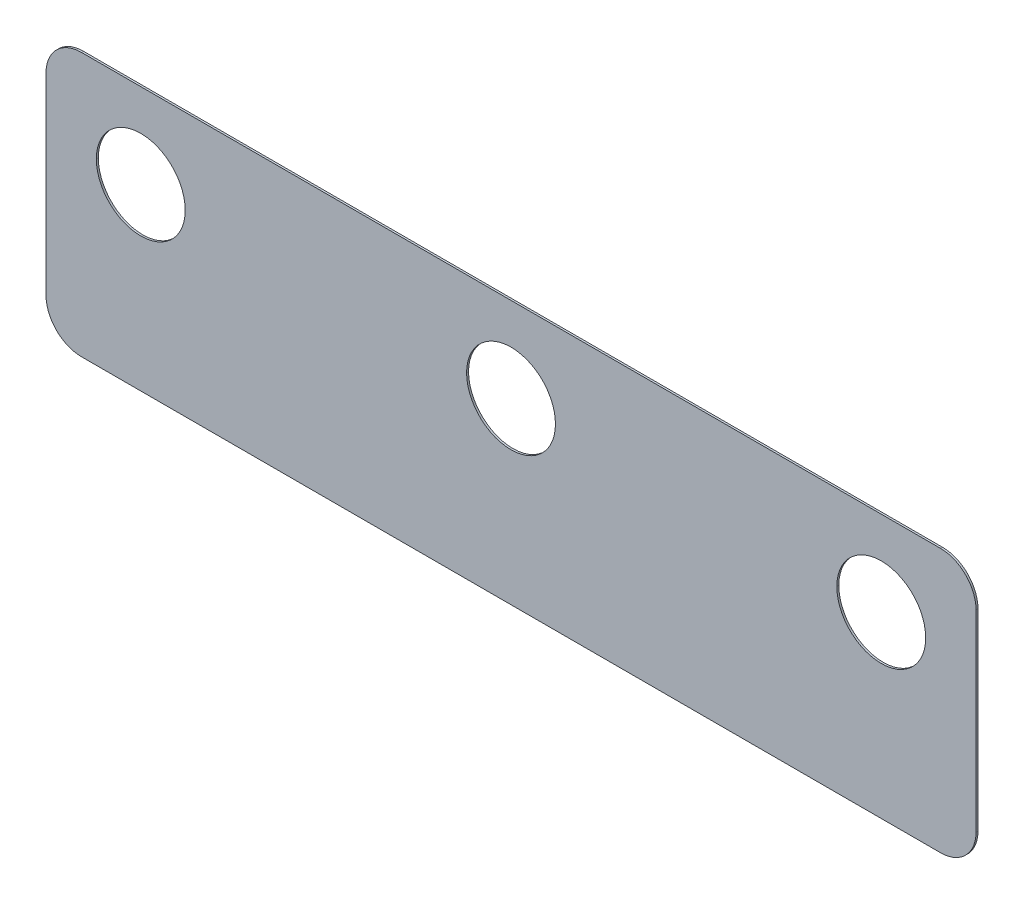
ISO-10303-21;
HEADER;
FILE_DESCRIPTION(('STEP AP214'),'2;1');
FILE_NAME('part.step','',(''),(''),'','','');
FILE_SCHEMA(('AUTOMOTIVE_DESIGN { 1 0 10303 214 1 1 1 1 }'));
ENDSEC;
DATA;
#1=APPLICATION_CONTEXT('core data for automotive mechanical design processes');
#2=APPLICATION_PROTOCOL_DEFINITION('international standard','automotive_design',2000,#1);
#3=PRODUCT_CONTEXT('',#1,'mechanical');
#4=PRODUCT('Part','Part','',(#3));
#5=PRODUCT_RELATED_PRODUCT_CATEGORY('part','',(#4));
#6=PRODUCT_DEFINITION_FORMATION('','',#4);
#7=PRODUCT_DEFINITION_CONTEXT('part definition',#1,'design');
#8=PRODUCT_DEFINITION('design','',#6,#7);
#9=PRODUCT_DEFINITION_SHAPE('','',#8);
#10=(LENGTH_UNIT() NAMED_UNIT(*) SI_UNIT(.MILLI.,.METRE.));
#11=(NAMED_UNIT(*) PLANE_ANGLE_UNIT() SI_UNIT($,.RADIAN.));
#12=(NAMED_UNIT(*) SI_UNIT($,.STERADIAN.) SOLID_ANGLE_UNIT());
#13=UNCERTAINTY_MEASURE_WITH_UNIT(LENGTH_MEASURE(1.E-05),#10,'distance_accuracy_value','');
#14=(GEOMETRIC_REPRESENTATION_CONTEXT(3) GLOBAL_UNCERTAINTY_ASSIGNED_CONTEXT((#13)) GLOBAL_UNIT_ASSIGNED_CONTEXT((#10,
#11,#12)) REPRESENTATION_CONTEXT('',''));
#15=CARTESIAN_POINT('',(0.,0.,0.));
#16=DIRECTION('',(0.,0.,1.));
#17=DIRECTION('',(1.,0.,0.));
#18=AXIS2_PLACEMENT_3D('',#15,#16,#17);
#19=CARTESIAN_POINT('',(47.1,8.6,0.));
#20=DIRECTION('',(0.,1.,0.));
#21=DIRECTION('',(1.,0.,0.));
#22=AXIS2_PLACEMENT_3D('',#19,#20,#21);
#23=PLANE('',#22);
#24=DIRECTION('',(-1.,0.,0.));
#25=VECTOR('',#24,1.);
#26=CARTESIAN_POINT('',(43.5,8.6,0.));
#27=LINE('',#26,#25);
#28=CARTESIAN_POINT('',(43.5,8.6,0.));
#29=VERTEX_POINT('',#28);
#30=CARTESIAN_POINT('',(-43.5,8.6,0.));
#31=VERTEX_POINT('',#30);
#32=EDGE_CURVE('E233',#29,#31,#27,.T.);
#33=ORIENTED_EDGE('',*,*,#32,.T.);
#34=DIRECTION('',(0.,0.,-1.));
#35=VECTOR('',#34,1.);
#36=CARTESIAN_POINT('',(-43.5,8.6,0.2));
#37=LINE('',#36,#35);
#38=CARTESIAN_POINT('',(-43.5,8.6,0.2));
#39=VERTEX_POINT('',#38);
#40=EDGE_CURVE('E11',#39,#31,#37,.T.);
#41=ORIENTED_EDGE('',*,*,#40,.F.);
#42=DIRECTION('',(-1.,0.,0.));
#43=VECTOR('',#42,1.);
#44=CARTESIAN_POINT('',(43.5,8.6,0.2));
#45=LINE('',#44,#43);
#46=CARTESIAN_POINT('',(43.5,8.6,0.2));
#47=VERTEX_POINT('',#46);
#48=EDGE_CURVE('E204',#47,#39,#45,.T.);
#49=ORIENTED_EDGE('',*,*,#48,.F.);
#50=DIRECTION('',(0.,0.,-1.));
#51=VECTOR('',#50,1.);
#52=CARTESIAN_POINT('',(43.5,8.6,0.2));
#53=LINE('',#52,#51);
#54=EDGE_CURVE('E228',#47,#29,#53,.T.);
#55=ORIENTED_EDGE('',*,*,#54,.T.);
#56=EDGE_LOOP('',(#33,#41,#49,#55));
#57=FACE_BOUND('',#56,.T.);
#58=ADVANCED_FACE('F17',(#57),#23,.T.);
#59=CARTESIAN_POINT('',(-43.5,5.,4.54888));
#60=DIRECTION('',(0.,0.,-1.));
#61=DIRECTION('',(-1.,0.,0.));
#62=AXIS2_PLACEMENT_3D('',#59,#60,#61);
#63=CYLINDRICAL_SURFACE('',#62,3.6);
#64=DIRECTION('',(0.,0.,-1.));
#65=VECTOR('',#64,1.);
#66=CARTESIAN_POINT('',(-47.1,5.,0.2));
#67=LINE('',#66,#65);
#68=CARTESIAN_POINT('',(-47.1,5.,0.2));
#69=VERTEX_POINT('',#68);
#70=CARTESIAN_POINT('',(-47.1,5.,0.));
#71=VERTEX_POINT('',#70);
#72=EDGE_CURVE('E27',#69,#71,#67,.T.);
#73=ORIENTED_EDGE('',*,*,#72,.F.);
#74=CARTESIAN_POINT('',(-43.5,5.,0.2));
#75=DIRECTION('',(0.,0.,1.));
#76=DIRECTION('',(0.,1.,0.));
#77=AXIS2_PLACEMENT_3D('',#74,#75,#76);
#78=CIRCLE('',#77,3.6);
#79=EDGE_CURVE('E214',#39,#69,#78,.T.);
#80=ORIENTED_EDGE('',*,*,#79,.F.);
#81=ORIENTED_EDGE('',*,*,#40,.T.);
#82=CARTESIAN_POINT('',(-43.5,5.,0.));
#83=DIRECTION('',(0.,0.,-1.));
#84=DIRECTION('',(-1.,0.,0.));
#85=AXIS2_PLACEMENT_3D('',#82,#83,#84);
#86=CIRCLE('',#85,3.6);
#87=EDGE_CURVE('E229',#71,#31,#86,.T.);
#88=ORIENTED_EDGE('',*,*,#87,.F.);
#89=EDGE_LOOP('',(#73,#80,#81,#88));
#90=FACE_BOUND('',#89,.T.);
#91=ADVANCED_FACE('F343',(#90),#63,.T.);
#92=CARTESIAN_POINT('',(-47.1,8.6,0.));
#93=DIRECTION('',(-1.,0.,0.));
#94=DIRECTION('',(0.,0.,1.));
#95=AXIS2_PLACEMENT_3D('',#92,#93,#94);
#96=PLANE('',#95);
#97=DIRECTION('',(0.,-1.,0.));
#98=VECTOR('',#97,1.);
#99=CARTESIAN_POINT('',(-47.1,5.,0.));
#100=LINE('',#99,#98);
#101=CARTESIAN_POINT('',(-47.1,-14.5,0.));
#102=VERTEX_POINT('',#101);
#103=EDGE_CURVE('E234',#71,#102,#100,.T.);
#104=ORIENTED_EDGE('',*,*,#103,.T.);
#105=DIRECTION('',(0.,0.,-1.));
#106=VECTOR('',#105,1.);
#107=CARTESIAN_POINT('',(-47.1,-14.5,0.2));
#108=LINE('',#107,#106);
#109=CARTESIAN_POINT('',(-47.1,-14.5,0.2));
#110=VERTEX_POINT('',#109);
#111=EDGE_CURVE('E248',#110,#102,#108,.T.);
#112=ORIENTED_EDGE('',*,*,#111,.F.);
#113=DIRECTION('',(0.,-1.,0.));
#114=VECTOR('',#113,1.);
#115=CARTESIAN_POINT('',(-47.1,5.,0.2));
#116=LINE('',#115,#114);
#117=EDGE_CURVE('E242',#69,#110,#116,.T.);
#118=ORIENTED_EDGE('',*,*,#117,.F.);
#119=ORIENTED_EDGE('',*,*,#72,.T.);
#120=EDGE_LOOP('',(#104,#112,#118,#119));
#121=FACE_BOUND('',#120,.T.);
#122=ADVANCED_FACE('F339',(#121),#96,.T.);
#123=CARTESIAN_POINT('',(-43.5,-14.5,4.54888));
#124=DIRECTION('',(0.,0.,-1.));
#125=DIRECTION('',(0.,-1.,0.));
#126=AXIS2_PLACEMENT_3D('',#123,#124,#125);
#127=CYLINDRICAL_SURFACE('',#126,3.6);
#128=DIRECTION('',(0.,0.,-1.));
#129=VECTOR('',#128,1.);
#130=CARTESIAN_POINT('',(-43.5,-18.1,0.2));
#131=LINE('',#130,#129);
#132=CARTESIAN_POINT('',(-43.5,-18.1,0.2));
#133=VERTEX_POINT('',#132);
#134=CARTESIAN_POINT('',(-43.5,-18.1,0.));
#135=VERTEX_POINT('',#134);
#136=EDGE_CURVE('E208',#133,#135,#131,.T.);
#137=ORIENTED_EDGE('',*,*,#136,.F.);
#138=CARTESIAN_POINT('',(-43.5,-14.5,0.2));
#139=DIRECTION('',(0.,0.,1.));
#140=DIRECTION('',(-1.,0.,0.));
#141=AXIS2_PLACEMENT_3D('',#138,#139,#140);
#142=CIRCLE('',#141,3.6);
#143=EDGE_CURVE('E192',#110,#133,#142,.T.);
#144=ORIENTED_EDGE('',*,*,#143,.F.);
#145=ORIENTED_EDGE('',*,*,#111,.T.);
#146=CARTESIAN_POINT('',(-43.5,-14.5,0.));
#147=DIRECTION('',(0.,0.,-1.));
#148=DIRECTION('',(0.,-1.,0.));
#149=AXIS2_PLACEMENT_3D('',#146,#147,#148);
#150=CIRCLE('',#149,3.6);
#151=EDGE_CURVE('E235',#135,#102,#150,.T.);
#152=ORIENTED_EDGE('',*,*,#151,.F.);
#153=EDGE_LOOP('',(#137,#144,#145,#152));
#154=FACE_BOUND('',#153,.T.);
#155=ADVANCED_FACE('F346',(#154),#127,.T.);
#156=CARTESIAN_POINT('',(-47.1,-18.1,0.));
#157=DIRECTION('',(0.,-1.,0.));
#158=DIRECTION('',(0.,0.,-1.));
#159=AXIS2_PLACEMENT_3D('',#156,#157,#158);
#160=PLANE('',#159);
#161=DIRECTION('',(1.,0.,0.));
#162=VECTOR('',#161,1.);
#163=CARTESIAN_POINT('',(-43.5,-18.1,0.2));
#164=LINE('',#163,#162);
#165=CARTESIAN_POINT('',(43.5,-18.1,0.2));
#166=VERTEX_POINT('',#165);
#167=EDGE_CURVE('E185',#133,#166,#164,.T.);
#168=ORIENTED_EDGE('',*,*,#167,.F.);
#169=ORIENTED_EDGE('',*,*,#136,.T.);
#170=DIRECTION('',(1.,0.,0.));
#171=VECTOR('',#170,1.);
#172=CARTESIAN_POINT('',(-43.5,-18.1,0.));
#173=LINE('',#172,#171);
#174=CARTESIAN_POINT('',(43.5,-18.1,0.));
#175=VERTEX_POINT('',#174);
#176=EDGE_CURVE('E238',#135,#175,#173,.T.);
#177=ORIENTED_EDGE('',*,*,#176,.T.);
#178=DIRECTION('',(0.,0.,-1.));
#179=VECTOR('',#178,1.);
#180=CARTESIAN_POINT('',(43.5,-18.1,0.2));
#181=LINE('',#180,#179);
#182=EDGE_CURVE('E169',#166,#175,#181,.T.);
#183=ORIENTED_EDGE('',*,*,#182,.F.);
#184=EDGE_LOOP('',(#168,#169,#177,#183));
#185=FACE_BOUND('',#184,.T.);
#186=ADVANCED_FACE('F354',(#185),#160,.T.);
#187=CARTESIAN_POINT('',(43.5,-14.5,4.54888));
#188=DIRECTION('',(0.,0.,-1.));
#189=DIRECTION('',(1.,0.,0.));
#190=AXIS2_PLACEMENT_3D('',#187,#188,#189);
#191=CYLINDRICAL_SURFACE('',#190,3.6);
#192=DIRECTION('',(0.,0.,-1.));
#193=VECTOR('',#192,1.);
#194=CARTESIAN_POINT('',(47.1,-14.5,0.2));
#195=LINE('',#194,#193);
#196=CARTESIAN_POINT('',(47.1,-14.5,0.2));
#197=VERTEX_POINT('',#196);
#198=CARTESIAN_POINT('',(47.1,-14.5,0.));
#199=VERTEX_POINT('',#198);
#200=EDGE_CURVE('E157',#197,#199,#195,.T.);
#201=ORIENTED_EDGE('',*,*,#200,.F.);
#202=CARTESIAN_POINT('',(43.5,-14.5,0.2));
#203=DIRECTION('',(0.,0.,1.));
#204=DIRECTION('',(0.,-1.,0.));
#205=AXIS2_PLACEMENT_3D('',#202,#203,#204);
#206=CIRCLE('',#205,3.6);
#207=EDGE_CURVE('E161',#166,#197,#206,.T.);
#208=ORIENTED_EDGE('',*,*,#207,.F.);
#209=ORIENTED_EDGE('',*,*,#182,.T.);
#210=CARTESIAN_POINT('',(43.5,-14.5,0.));
#211=DIRECTION('',(0.,0.,-1.));
#212=DIRECTION('',(1.,0.,0.));
#213=AXIS2_PLACEMENT_3D('',#210,#211,#212);
#214=CIRCLE('',#213,3.6);
#215=EDGE_CURVE('E164',#199,#175,#214,.T.);
#216=ORIENTED_EDGE('',*,*,#215,.F.);
#217=EDGE_LOOP('',(#201,#208,#209,#216));
#218=FACE_BOUND('',#217,.T.);
#219=ADVANCED_FACE('F159',(#218),#191,.T.);
#220=CARTESIAN_POINT('',(47.1,-18.1,0.));
#221=DIRECTION('',(1.,0.,0.));
#222=DIRECTION('',(0.,1.,0.));
#223=AXIS2_PLACEMENT_3D('',#220,#221,#222);
#224=PLANE('',#223);
#225=DIRECTION('',(0.,1.,0.));
#226=VECTOR('',#225,1.);
#227=CARTESIAN_POINT('',(47.1,-14.5,0.2));
#228=LINE('',#227,#226);
#229=CARTESIAN_POINT('',(47.1,5.,0.2));
#230=VERTEX_POINT('',#229);
#231=EDGE_CURVE('E173',#197,#230,#228,.T.);
#232=ORIENTED_EDGE('',*,*,#231,.F.);
#233=ORIENTED_EDGE('',*,*,#200,.T.);
#234=DIRECTION('',(0.,1.,0.));
#235=VECTOR('',#234,1.);
#236=CARTESIAN_POINT('',(47.1,-14.5,0.));
#237=LINE('',#236,#235);
#238=CARTESIAN_POINT('',(47.1,5.,0.));
#239=VERTEX_POINT('',#238);
#240=EDGE_CURVE('E209',#199,#239,#237,.T.);
#241=ORIENTED_EDGE('',*,*,#240,.T.);
#242=DIRECTION('',(0.,0.,-1.));
#243=VECTOR('',#242,1.);
#244=CARTESIAN_POINT('',(47.1,5.,0.2));
#245=LINE('',#244,#243);
#246=EDGE_CURVE('E170',#230,#239,#245,.T.);
#247=ORIENTED_EDGE('',*,*,#246,.F.);
#248=EDGE_LOOP('',(#232,#233,#241,#247));
#249=FACE_BOUND('',#248,.T.);
#250=ADVANCED_FACE('F174',(#249),#224,.T.);
#251=CARTESIAN_POINT('',(43.5,5.,4.54888));
#252=DIRECTION('',(0.,0.,-1.));
#253=DIRECTION('',(0.,1.,0.));
#254=AXIS2_PLACEMENT_3D('',#251,#252,#253);
#255=CYLINDRICAL_SURFACE('',#254,3.6);
#256=ORIENTED_EDGE('',*,*,#54,.F.);
#257=CARTESIAN_POINT('',(43.5,5.,0.2));
#258=DIRECTION('',(0.,0.,1.));
#259=DIRECTION('',(1.,0.,0.));
#260=AXIS2_PLACEMENT_3D('',#257,#258,#259);
#261=CIRCLE('',#260,3.6);
#262=EDGE_CURVE('E179',#230,#47,#261,.T.);
#263=ORIENTED_EDGE('',*,*,#262,.F.);
#264=ORIENTED_EDGE('',*,*,#246,.T.);
#265=CARTESIAN_POINT('',(43.5,5.,0.));
#266=DIRECTION('',(0.,0.,-1.));
#267=DIRECTION('',(0.,1.,0.));
#268=AXIS2_PLACEMENT_3D('',#265,#266,#267);
#269=CIRCLE('',#268,3.6);
#270=EDGE_CURVE('E200',#29,#239,#269,.T.);
#271=ORIENTED_EDGE('',*,*,#270,.F.);
#272=EDGE_LOOP('',(#256,#263,#264,#271));
#273=FACE_BOUND('',#272,.T.);
#274=ADVANCED_FACE('F296',(#273),#255,.T.);
#275=CARTESIAN_POINT('',(37.5,0.,0.));
#276=DIRECTION('',(0.,0.,1.));
#277=DIRECTION('',(1.,0.,0.));
#278=AXIS2_PLACEMENT_3D('',#275,#276,#277);
#279=CYLINDRICAL_SURFACE('',#278,4.5);
#280=DIRECTION('',(0.,0.,1.));
#281=VECTOR('',#280,1.);
#282=CARTESIAN_POINT('',(42.,0.,0.));
#283=LINE('',#282,#281);
#284=CARTESIAN_POINT('',(42.,0.,0.));
#285=VERTEX_POINT('',#284);
#286=CARTESIAN_POINT('',(42.,0.,0.2));
#287=VERTEX_POINT('',#286);
#288=EDGE_CURVE('E41',#285,#287,#283,.T.);
#289=ORIENTED_EDGE('',*,*,#288,.T.);
#290=CARTESIAN_POINT('',(37.5,0.,0.2));
#291=DIRECTION('',(0.,0.,-1.));
#292=DIRECTION('',(-1.,0.,0.));
#293=AXIS2_PLACEMENT_3D('',#290,#291,#292);
#294=CIRCLE('',#293,4.5);
#295=CARTESIAN_POINT('',(33.,0.,0.2));
#296=VERTEX_POINT('',#295);
#297=EDGE_CURVE('E259',#296,#287,#294,.T.);
#298=ORIENTED_EDGE('',*,*,#297,.F.);
#299=DIRECTION('',(0.,0.,1.));
#300=VECTOR('',#299,1.);
#301=CARTESIAN_POINT('',(33.,0.,0.));
#302=LINE('',#301,#300);
#303=CARTESIAN_POINT('',(33.,0.,0.));
#304=VERTEX_POINT('',#303);
#305=EDGE_CURVE('E263',#304,#296,#302,.T.);
#306=ORIENTED_EDGE('',*,*,#305,.F.);
#307=CARTESIAN_POINT('',(37.5,0.,0.));
#308=DIRECTION('',(0.,0.,-1.));
#309=DIRECTION('',(-1.,0.,0.));
#310=AXIS2_PLACEMENT_3D('',#307,#308,#309);
#311=CIRCLE('',#310,4.5);
#312=EDGE_CURVE('E225',#304,#285,#311,.T.);
#313=ORIENTED_EDGE('',*,*,#312,.T.);
#314=EDGE_LOOP('',(#289,#298,#306,#313));
#315=FACE_BOUND('',#314,.T.);
#316=ADVANCED_FACE('F382',(#315),#279,.F.);
#317=CARTESIAN_POINT('',(37.5,0.,0.));
#318=DIRECTION('',(0.,0.,1.));
#319=DIRECTION('',(1.,0.,0.));
#320=AXIS2_PLACEMENT_3D('',#317,#318,#319);
#321=CYLINDRICAL_SURFACE('',#320,4.5);
#322=ORIENTED_EDGE('',*,*,#305,.T.);
#323=CARTESIAN_POINT('',(37.5,0.,0.2));
#324=DIRECTION('',(0.,0.,-1.));
#325=DIRECTION('',(1.,0.,0.));
#326=AXIS2_PLACEMENT_3D('',#323,#324,#325);
#327=CIRCLE('',#326,4.5);
#328=EDGE_CURVE('E245',#287,#296,#327,.T.);
#329=ORIENTED_EDGE('',*,*,#328,.F.);
#330=ORIENTED_EDGE('',*,*,#288,.F.);
#331=CARTESIAN_POINT('',(37.5,0.,0.));
#332=DIRECTION('',(0.,0.,-1.));
#333=DIRECTION('',(1.,0.,0.));
#334=AXIS2_PLACEMENT_3D('',#331,#332,#333);
#335=CIRCLE('',#334,4.5);
#336=EDGE_CURVE('E221',#285,#304,#335,.T.);
#337=ORIENTED_EDGE('',*,*,#336,.T.);
#338=EDGE_LOOP('',(#322,#329,#330,#337));
#339=FACE_BOUND('',#338,.T.);
#340=ADVANCED_FACE('F380',(#339),#321,.F.);
#341=CARTESIAN_POINT('',(0.,0.,0.));
#342=DIRECTION('',(0.,0.,1.));
#343=DIRECTION('',(1.,0.,0.));
#344=AXIS2_PLACEMENT_3D('',#341,#342,#343);
#345=CYLINDRICAL_SURFACE('',#344,4.5);
#346=DIRECTION('',(0.,0.,1.));
#347=VECTOR('',#346,1.);
#348=CARTESIAN_POINT('',(4.5,0.,0.));
#349=LINE('',#348,#347);
#350=CARTESIAN_POINT('',(4.5,0.,0.));
#351=VERTEX_POINT('',#350);
#352=CARTESIAN_POINT('',(4.5,0.,0.2));
#353=VERTEX_POINT('',#352);
#354=EDGE_CURVE('E77',#351,#353,#349,.T.);
#355=ORIENTED_EDGE('',*,*,#354,.T.);
#356=CARTESIAN_POINT('',(0.,0.,0.2));
#357=DIRECTION('',(0.,0.,-1.));
#358=DIRECTION('',(-1.,0.,0.));
#359=AXIS2_PLACEMENT_3D('',#356,#357,#358);
#360=CIRCLE('',#359,4.5);
#361=CARTESIAN_POINT('',(-4.5,0.,0.2));
#362=VERTEX_POINT('',#361);
#363=EDGE_CURVE('E258',#362,#353,#360,.T.);
#364=ORIENTED_EDGE('',*,*,#363,.F.);
#365=DIRECTION('',(0.,0.,1.));
#366=VECTOR('',#365,1.);
#367=CARTESIAN_POINT('',(-4.5,0.,0.));
#368=LINE('',#367,#366);
#369=CARTESIAN_POINT('',(-4.5,0.,0.));
#370=VERTEX_POINT('',#369);
#371=EDGE_CURVE('E89',#370,#362,#368,.T.);
#372=ORIENTED_EDGE('',*,*,#371,.F.);
#373=CARTESIAN_POINT('',(0.,0.,0.));
#374=DIRECTION('',(0.,0.,-1.));
#375=DIRECTION('',(-1.,0.,0.));
#376=AXIS2_PLACEMENT_3D('',#373,#374,#375);
#377=CIRCLE('',#376,4.5);
#378=EDGE_CURVE('E197',#370,#351,#377,.T.);
#379=ORIENTED_EDGE('',*,*,#378,.T.);
#380=EDGE_LOOP('',(#355,#364,#372,#379));
#381=FACE_BOUND('',#380,.T.);
#382=ADVANCED_FACE('F279',(#381),#345,.F.);
#383=CARTESIAN_POINT('',(0.,0.,0.));
#384=DIRECTION('',(0.,0.,1.));
#385=DIRECTION('',(1.,0.,0.));
#386=AXIS2_PLACEMENT_3D('',#383,#384,#385);
#387=CYLINDRICAL_SURFACE('',#386,4.5);
#388=ORIENTED_EDGE('',*,*,#371,.T.);
#389=CARTESIAN_POINT('',(0.,0.,0.2));
#390=DIRECTION('',(0.,0.,-1.));
#391=DIRECTION('',(1.,0.,0.));
#392=AXIS2_PLACEMENT_3D('',#389,#390,#391);
#393=CIRCLE('',#392,4.5);
#394=EDGE_CURVE('E20',#353,#362,#393,.T.);
#395=ORIENTED_EDGE('',*,*,#394,.F.);
#396=ORIENTED_EDGE('',*,*,#354,.F.);
#397=CARTESIAN_POINT('',(0.,0.,0.));
#398=DIRECTION('',(0.,0.,-1.));
#399=DIRECTION('',(1.,0.,0.));
#400=AXIS2_PLACEMENT_3D('',#397,#398,#399);
#401=CIRCLE('',#400,4.5);
#402=EDGE_CURVE('E199',#351,#370,#401,.T.);
#403=ORIENTED_EDGE('',*,*,#402,.T.);
#404=EDGE_LOOP('',(#388,#395,#396,#403));
#405=FACE_BOUND('',#404,.T.);
#406=ADVANCED_FACE('F282',(#405),#387,.F.);
#407=CARTESIAN_POINT('',(0.,0.,0.2));
#408=DIRECTION('',(0.,0.,1.));
#409=DIRECTION('',(1.,0.,0.));
#410=AXIS2_PLACEMENT_3D('',#407,#408,#409);
#411=PLANE('',#410);
#412=CARTESIAN_POINT('',(-37.5,0.,0.2));
#413=DIRECTION('',(0.,0.,-1.));
#414=DIRECTION('',(-1.,0.,0.));
#415=AXIS2_PLACEMENT_3D('',#412,#413,#414);
#416=CIRCLE('',#415,4.5);
#417=CARTESIAN_POINT('',(-42.,0.,0.2));
#418=VERTEX_POINT('',#417);
#419=CARTESIAN_POINT('',(-33.,0.,0.2));
#420=VERTEX_POINT('',#419);
#421=EDGE_CURVE('E201',#418,#420,#416,.T.);
#422=ORIENTED_EDGE('',*,*,#421,.T.);
#423=CARTESIAN_POINT('',(-37.5,0.,0.2));
#424=DIRECTION('',(0.,0.,-1.));
#425=DIRECTION('',(1.,0.,0.));
#426=AXIS2_PLACEMENT_3D('',#423,#424,#425);
#427=CIRCLE('',#426,4.5);
#428=EDGE_CURVE('E269',#420,#418,#427,.T.);
#429=ORIENTED_EDGE('',*,*,#428,.T.);
#430=EDGE_LOOP('',(#422,#429));
#431=FACE_BOUND('',#430,.T.);
#432=ORIENTED_EDGE('',*,*,#297,.T.);
#433=ORIENTED_EDGE('',*,*,#328,.T.);
#434=EDGE_LOOP('',(#432,#433));
#435=FACE_BOUND('',#434,.T.);
#436=ORIENTED_EDGE('',*,*,#363,.T.);
#437=ORIENTED_EDGE('',*,*,#394,.T.);
#438=EDGE_LOOP('',(#436,#437));
#439=FACE_BOUND('',#438,.T.);
#440=ORIENTED_EDGE('',*,*,#48,.T.);
#441=ORIENTED_EDGE('',*,*,#79,.T.);
#442=ORIENTED_EDGE('',*,*,#117,.T.);
#443=ORIENTED_EDGE('',*,*,#143,.T.);
#444=ORIENTED_EDGE('',*,*,#167,.T.);
#445=ORIENTED_EDGE('',*,*,#207,.T.);
#446=ORIENTED_EDGE('',*,*,#231,.T.);
#447=ORIENTED_EDGE('',*,*,#262,.T.);
#448=EDGE_LOOP('',(#440,#441,#442,#443,#444,#445,#446,#447));
#449=FACE_BOUND('',#448,.T.);
#450=ADVANCED_FACE('F182',(#431,#435,#439,#449),#411,.T.);
#451=CARTESIAN_POINT('',(-37.5,0.,0.));
#452=DIRECTION('',(0.,0.,1.));
#453=DIRECTION('',(1.,0.,0.));
#454=AXIS2_PLACEMENT_3D('',#451,#452,#453);
#455=CYLINDRICAL_SURFACE('',#454,4.5);
#456=DIRECTION('',(0.,0.,1.));
#457=VECTOR('',#456,1.);
#458=CARTESIAN_POINT('',(-33.,0.,0.));
#459=LINE('',#458,#457);
#460=CARTESIAN_POINT('',(-33.,0.,0.));
#461=VERTEX_POINT('',#460);
#462=EDGE_CURVE('E205',#461,#420,#459,.T.);
#463=ORIENTED_EDGE('',*,*,#462,.T.);
#464=ORIENTED_EDGE('',*,*,#421,.F.);
#465=DIRECTION('',(0.,0.,1.));
#466=VECTOR('',#465,1.);
#467=CARTESIAN_POINT('',(-42.,0.,0.));
#468=LINE('',#467,#466);
#469=CARTESIAN_POINT('',(-42.,0.,0.));
#470=VERTEX_POINT('',#469);
#471=EDGE_CURVE('E219',#470,#418,#468,.T.);
#472=ORIENTED_EDGE('',*,*,#471,.F.);
#473=CARTESIAN_POINT('',(-37.5,0.,0.));
#474=DIRECTION('',(0.,0.,-1.));
#475=DIRECTION('',(-1.,0.,0.));
#476=AXIS2_PLACEMENT_3D('',#473,#474,#475);
#477=CIRCLE('',#476,4.5);
#478=EDGE_CURVE('E220',#470,#461,#477,.T.);
#479=ORIENTED_EDGE('',*,*,#478,.T.);
#480=EDGE_LOOP('',(#463,#464,#472,#479));
#481=FACE_BOUND('',#480,.T.);
#482=ADVANCED_FACE('F378',(#481),#455,.F.);
#483=CARTESIAN_POINT('',(-37.5,0.,0.));
#484=DIRECTION('',(0.,0.,1.));
#485=DIRECTION('',(1.,0.,0.));
#486=AXIS2_PLACEMENT_3D('',#483,#484,#485);
#487=CYLINDRICAL_SURFACE('',#486,4.5);
#488=ORIENTED_EDGE('',*,*,#471,.T.);
#489=ORIENTED_EDGE('',*,*,#428,.F.);
#490=ORIENTED_EDGE('',*,*,#462,.F.);
#491=CARTESIAN_POINT('',(-37.5,0.,0.));
#492=DIRECTION('',(0.,0.,-1.));
#493=DIRECTION('',(1.,0.,0.));
#494=AXIS2_PLACEMENT_3D('',#491,#492,#493);
#495=CIRCLE('',#494,4.5);
#496=EDGE_CURVE('E215',#461,#470,#495,.T.);
#497=ORIENTED_EDGE('',*,*,#496,.T.);
#498=EDGE_LOOP('',(#488,#489,#490,#497));
#499=FACE_BOUND('',#498,.T.);
#500=ADVANCED_FACE('F287',(#499),#487,.F.);
#501=CARTESIAN_POINT('',(0.,0.,0.));
#502=DIRECTION('',(0.,0.,1.));
#503=DIRECTION('',(1.,0.,0.));
#504=AXIS2_PLACEMENT_3D('',#501,#502,#503);
#505=PLANE('',#504);
#506=ORIENTED_EDGE('',*,*,#478,.F.);
#507=ORIENTED_EDGE('',*,*,#496,.F.);
#508=EDGE_LOOP('',(#506,#507));
#509=FACE_BOUND('',#508,.T.);
#510=ORIENTED_EDGE('',*,*,#312,.F.);
#511=ORIENTED_EDGE('',*,*,#336,.F.);
#512=EDGE_LOOP('',(#510,#511));
#513=FACE_BOUND('',#512,.T.);
#514=ORIENTED_EDGE('',*,*,#378,.F.);
#515=ORIENTED_EDGE('',*,*,#402,.F.);
#516=EDGE_LOOP('',(#514,#515));
#517=FACE_BOUND('',#516,.T.);
#518=ORIENTED_EDGE('',*,*,#240,.F.);
#519=ORIENTED_EDGE('',*,*,#215,.T.);
#520=ORIENTED_EDGE('',*,*,#176,.F.);
#521=ORIENTED_EDGE('',*,*,#151,.T.);
#522=ORIENTED_EDGE('',*,*,#103,.F.);
#523=ORIENTED_EDGE('',*,*,#87,.T.);
#524=ORIENTED_EDGE('',*,*,#32,.F.);
#525=ORIENTED_EDGE('',*,*,#270,.T.);
#526=EDGE_LOOP('',(#518,#519,#520,#521,#522,#523,#524,#525));
#527=FACE_BOUND('',#526,.T.);
#528=ADVANCED_FACE('F284',(#509,#513,#517,#527),#505,.F.);
#529=CLOSED_SHELL('',(#58,#91,#122,#155,#186,#219,#250,#274,#316,#340,#382,#406,#450,#482,#500,#528));
#530=MANIFOLD_SOLID_BREP('B1',#529);
#531=ADVANCED_BREP_SHAPE_REPRESENTATION('',(#18,#530),#14);
#532=SHAPE_DEFINITION_REPRESENTATION(#9,#531);
ENDSEC;
END-ISO-10303-21;
